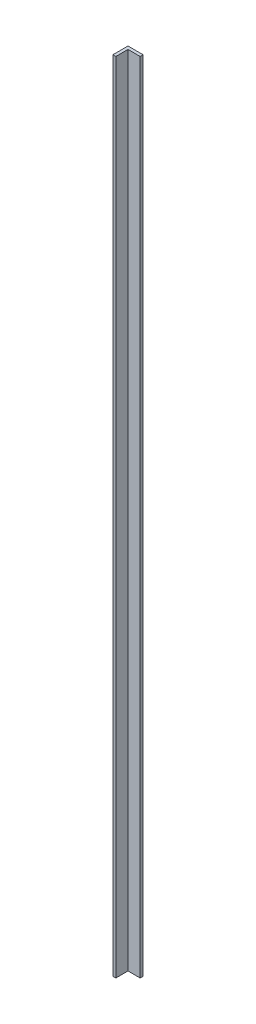
ISO-10303-21;
HEADER;
FILE_DESCRIPTION(('STEP AP214'),'2;1');
FILE_NAME('part.step','',(''),(''),'','','');
FILE_SCHEMA(('AUTOMOTIVE_DESIGN { 1 0 10303 214 1 1 1 1 }'));
ENDSEC;
DATA;
#1=APPLICATION_CONTEXT('core data for automotive mechanical design processes');
#2=APPLICATION_PROTOCOL_DEFINITION('international standard','automotive_design',2000,#1);
#3=PRODUCT_CONTEXT('',#1,'mechanical');
#4=PRODUCT('Part','Part','',(#3));
#5=PRODUCT_RELATED_PRODUCT_CATEGORY('part','',(#4));
#6=PRODUCT_DEFINITION_FORMATION('','',#4);
#7=PRODUCT_DEFINITION_CONTEXT('part definition',#1,'design');
#8=PRODUCT_DEFINITION('design','',#6,#7);
#9=PRODUCT_DEFINITION_SHAPE('','',#8);
#10=(LENGTH_UNIT() NAMED_UNIT(*) SI_UNIT(.MILLI.,.METRE.));
#11=(NAMED_UNIT(*) PLANE_ANGLE_UNIT() SI_UNIT($,.RADIAN.));
#12=(NAMED_UNIT(*) SI_UNIT($,.STERADIAN.) SOLID_ANGLE_UNIT());
#13=UNCERTAINTY_MEASURE_WITH_UNIT(LENGTH_MEASURE(1.E-05),#10,'distance_accuracy_value','');
#14=(GEOMETRIC_REPRESENTATION_CONTEXT(3) GLOBAL_UNCERTAINTY_ASSIGNED_CONTEXT((#13)) GLOBAL_UNIT_ASSIGNED_CONTEXT((#10,
#11,#12)) REPRESENTATION_CONTEXT('',''));
#15=CARTESIAN_POINT('',(0.,0.,0.));
#16=DIRECTION('',(0.,0.,1.));
#17=DIRECTION('',(1.,0.,0.));
#18=AXIS2_PLACEMENT_3D('',#15,#16,#17);
#19=CARTESIAN_POINT('',(0.,427.1518,0.));
#20=DIRECTION('',(-1.,0.,0.));
#21=DIRECTION('',(0.,0.,1.));
#22=AXIS2_PLACEMENT_3D('',#19,#20,#21);
#23=PLANE('',#22);
#24=DIRECTION('',(0.,0.,-1.));
#25=VECTOR('',#24,1.);
#26=CARTESIAN_POINT('',(0.,0.,0.));
#27=LINE('',#26,#25);
#28=CARTESIAN_POINT('',(0.,0.,6.5));
#29=VERTEX_POINT('',#28);
#30=CARTESIAN_POINT('',(0.,0.,0.));
#31=VERTEX_POINT('',#30);
#32=EDGE_CURVE('E117',#29,#31,#27,.T.);
#33=ORIENTED_EDGE('',*,*,#32,.T.);
#34=DIRECTION('',(0.,-1.,0.));
#35=VECTOR('',#34,1.);
#36=CARTESIAN_POINT('',(0.,427.1518,0.));
#37=LINE('',#36,#35);
#38=CARTESIAN_POINT('',(0.,427.1518,0.));
#39=VERTEX_POINT('',#38);
#40=EDGE_CURVE('E11',#39,#31,#37,.T.);
#41=ORIENTED_EDGE('',*,*,#40,.F.);
#42=DIRECTION('',(0.,0.,-1.));
#43=VECTOR('',#42,1.);
#44=CARTESIAN_POINT('',(0.,427.1518,0.));
#45=LINE('',#44,#43);
#46=CARTESIAN_POINT('',(0.,427.1518,6.5));
#47=VERTEX_POINT('',#46);
#48=EDGE_CURVE('E127',#47,#39,#45,.T.);
#49=ORIENTED_EDGE('',*,*,#48,.F.);
#50=DIRECTION('',(0.,-1.,0.));
#51=VECTOR('',#50,1.);
#52=CARTESIAN_POINT('',(0.,427.1518,6.5));
#53=LINE('',#52,#51);
#54=EDGE_CURVE('E113',#47,#29,#53,.T.);
#55=ORIENTED_EDGE('',*,*,#54,.T.);
#56=EDGE_LOOP('',(#33,#41,#49,#55));
#57=FACE_BOUND('',#56,.T.);
#58=ADVANCED_FACE('F33',(#57),#23,.F.);
#59=CARTESIAN_POINT('',(0.,427.1518,0.));
#60=DIRECTION('',(0.,0.,-1.));
#61=DIRECTION('',(-1.,0.,0.));
#62=AXIS2_PLACEMENT_3D('',#59,#60,#61);
#63=PLANE('',#62);
#64=DIRECTION('',(1.,0.,0.));
#65=VECTOR('',#64,1.);
#66=CARTESIAN_POINT('',(0.,0.,0.));
#67=LINE('',#66,#65);
#68=CARTESIAN_POINT('',(6.5,0.,0.));
#69=VERTEX_POINT('',#68);
#70=EDGE_CURVE('E120',#31,#69,#67,.T.);
#71=ORIENTED_EDGE('',*,*,#70,.T.);
#72=DIRECTION('',(0.,-1.,0.));
#73=VECTOR('',#72,1.);
#74=CARTESIAN_POINT('',(6.5,427.1518,0.));
#75=LINE('',#74,#73);
#76=CARTESIAN_POINT('',(6.5,427.1518,0.));
#77=VERTEX_POINT('',#76);
#78=EDGE_CURVE('E41',#77,#69,#75,.T.);
#79=ORIENTED_EDGE('',*,*,#78,.F.);
#80=DIRECTION('',(1.,0.,0.));
#81=VECTOR('',#80,1.);
#82=CARTESIAN_POINT('',(0.,427.1518,0.));
#83=LINE('',#82,#81);
#84=EDGE_CURVE('E86',#39,#77,#83,.T.);
#85=ORIENTED_EDGE('',*,*,#84,.F.);
#86=ORIENTED_EDGE('',*,*,#40,.T.);
#87=EDGE_LOOP('',(#71,#79,#85,#86));
#88=FACE_BOUND('',#87,.T.);
#89=ADVANCED_FACE('F151',(#88),#63,.F.);
#90=CARTESIAN_POINT('',(6.5,427.1518,0.));
#91=DIRECTION('',(-1.,0.,0.));
#92=DIRECTION('',(0.,0.,1.));
#93=AXIS2_PLACEMENT_3D('',#90,#91,#92);
#94=PLANE('',#93);
#95=DIRECTION('',(0.,0.,-1.));
#96=VECTOR('',#95,1.);
#97=CARTESIAN_POINT('',(6.5,0.,0.));
#98=LINE('',#97,#96);
#99=CARTESIAN_POINT('',(6.5,0.,-1.5875));
#100=VERTEX_POINT('',#99);
#101=EDGE_CURVE('E122',#69,#100,#98,.T.);
#102=ORIENTED_EDGE('',*,*,#101,.T.);
#103=DIRECTION('',(0.,-1.,0.));
#104=VECTOR('',#103,1.);
#105=CARTESIAN_POINT('',(6.5,427.1518,-1.5875));
#106=LINE('',#105,#104);
#107=CARTESIAN_POINT('',(6.5,427.1518,-1.5875));
#108=VERTEX_POINT('',#107);
#109=EDGE_CURVE('E108',#108,#100,#106,.T.);
#110=ORIENTED_EDGE('',*,*,#109,.F.);
#111=DIRECTION('',(0.,0.,-1.));
#112=VECTOR('',#111,1.);
#113=CARTESIAN_POINT('',(6.5,427.1518,0.));
#114=LINE('',#113,#112);
#115=EDGE_CURVE('E99',#77,#108,#114,.T.);
#116=ORIENTED_EDGE('',*,*,#115,.F.);
#117=ORIENTED_EDGE('',*,*,#78,.T.);
#118=EDGE_LOOP('',(#102,#110,#116,#117));
#119=FACE_BOUND('',#118,.T.);
#120=ADVANCED_FACE('F133',(#119),#94,.F.);
#121=CARTESIAN_POINT('',(-1.5875,427.1518,-1.5875));
#122=DIRECTION('',(0.,0.,1.));
#123=DIRECTION('',(1.,0.,0.));
#124=AXIS2_PLACEMENT_3D('',#121,#122,#123);
#125=PLANE('',#124);
#126=DIRECTION('',(-1.,0.,0.));
#127=VECTOR('',#126,1.);
#128=CARTESIAN_POINT('',(-1.5875,0.,-1.5875));
#129=LINE('',#128,#127);
#130=CARTESIAN_POINT('',(-1.5875,0.,-1.5875));
#131=VERTEX_POINT('',#130);
#132=EDGE_CURVE('E107',#100,#131,#129,.T.);
#133=ORIENTED_EDGE('',*,*,#132,.T.);
#134=DIRECTION('',(0.,-1.,0.));
#135=VECTOR('',#134,1.);
#136=CARTESIAN_POINT('',(-1.5875,427.1518,-1.5875));
#137=LINE('',#136,#135);
#138=CARTESIAN_POINT('',(-1.5875,427.1518,-1.5875));
#139=VERTEX_POINT('',#138);
#140=EDGE_CURVE('E104',#139,#131,#137,.T.);
#141=ORIENTED_EDGE('',*,*,#140,.F.);
#142=DIRECTION('',(-1.,0.,0.));
#143=VECTOR('',#142,1.);
#144=CARTESIAN_POINT('',(-1.5875,427.1518,-1.5875));
#145=LINE('',#144,#143);
#146=EDGE_CURVE('E93',#108,#139,#145,.T.);
#147=ORIENTED_EDGE('',*,*,#146,.F.);
#148=ORIENTED_EDGE('',*,*,#109,.T.);
#149=EDGE_LOOP('',(#133,#141,#147,#148));
#150=FACE_BOUND('',#149,.T.);
#151=ADVANCED_FACE('F105',(#150),#125,.F.);
#152=CARTESIAN_POINT('',(-1.5875,427.1518,-1.5875));
#153=DIRECTION('',(1.,0.,0.));
#154=DIRECTION('',(0.,0.,-1.));
#155=AXIS2_PLACEMENT_3D('',#152,#153,#154);
#156=PLANE('',#155);
#157=DIRECTION('',(0.,0.,1.));
#158=VECTOR('',#157,1.);
#159=CARTESIAN_POINT('',(-1.5875,0.,-1.5875));
#160=LINE('',#159,#158);
#161=CARTESIAN_POINT('',(-1.5875,0.,6.5));
#162=VERTEX_POINT('',#161);
#163=EDGE_CURVE('E72',#131,#162,#160,.T.);
#164=ORIENTED_EDGE('',*,*,#163,.T.);
#165=DIRECTION('',(0.,-1.,0.));
#166=VECTOR('',#165,1.);
#167=CARTESIAN_POINT('',(-1.5875,427.1518,6.5));
#168=LINE('',#167,#166);
#169=CARTESIAN_POINT('',(-1.5875,427.1518,6.5));
#170=VERTEX_POINT('',#169);
#171=EDGE_CURVE('E109',#170,#162,#168,.T.);
#172=ORIENTED_EDGE('',*,*,#171,.F.);
#173=DIRECTION('',(0.,0.,1.));
#174=VECTOR('',#173,1.);
#175=CARTESIAN_POINT('',(-1.5875,427.1518,-1.5875));
#176=LINE('',#175,#174);
#177=EDGE_CURVE('E97',#139,#170,#176,.T.);
#178=ORIENTED_EDGE('',*,*,#177,.F.);
#179=ORIENTED_EDGE('',*,*,#140,.T.);
#180=EDGE_LOOP('',(#164,#172,#178,#179));
#181=FACE_BOUND('',#180,.T.);
#182=ADVANCED_FACE('F111',(#181),#156,.F.);
#183=CARTESIAN_POINT('',(-1.5875,427.1518,6.5));
#184=DIRECTION('',(0.,0.,-1.));
#185=DIRECTION('',(-1.,0.,0.));
#186=AXIS2_PLACEMENT_3D('',#183,#184,#185);
#187=PLANE('',#186);
#188=DIRECTION('',(1.,0.,0.));
#189=VECTOR('',#188,1.);
#190=CARTESIAN_POINT('',(-1.5875,0.,6.5));
#191=LINE('',#190,#189);
#192=EDGE_CURVE('E78',#162,#29,#191,.T.);
#193=ORIENTED_EDGE('',*,*,#192,.T.);
#194=ORIENTED_EDGE('',*,*,#54,.F.);
#195=DIRECTION('',(1.,0.,0.));
#196=VECTOR('',#195,1.);
#197=CARTESIAN_POINT('',(-1.5875,427.1518,6.5));
#198=LINE('',#197,#196);
#199=EDGE_CURVE('E49',#170,#47,#198,.T.);
#200=ORIENTED_EDGE('',*,*,#199,.F.);
#201=ORIENTED_EDGE('',*,*,#171,.T.);
#202=EDGE_LOOP('',(#193,#194,#200,#201));
#203=FACE_BOUND('',#202,.T.);
#204=ADVANCED_FACE('F140',(#203),#187,.F.);
#205=CARTESIAN_POINT('',(0.,427.1518,0.));
#206=DIRECTION('',(0.,1.,0.));
#207=DIRECTION('',(0.,0.,1.));
#208=AXIS2_PLACEMENT_3D('',#205,#206,#207);
#209=PLANE('',#208);
#210=ORIENTED_EDGE('',*,*,#48,.T.);
#211=ORIENTED_EDGE('',*,*,#84,.T.);
#212=ORIENTED_EDGE('',*,*,#115,.T.);
#213=ORIENTED_EDGE('',*,*,#146,.T.);
#214=ORIENTED_EDGE('',*,*,#177,.T.);
#215=ORIENTED_EDGE('',*,*,#199,.T.);
#216=EDGE_LOOP('',(#210,#211,#212,#213,#214,#215));
#217=FACE_BOUND('',#216,.T.);
#218=ADVANCED_FACE('F95',(#217),#209,.T.);
#219=CARTESIAN_POINT('',(0.,0.,0.));
#220=DIRECTION('',(0.,1.,0.));
#221=DIRECTION('',(0.,0.,1.));
#222=AXIS2_PLACEMENT_3D('',#219,#220,#221);
#223=PLANE('',#222);
#224=ORIENTED_EDGE('',*,*,#32,.F.);
#225=ORIENTED_EDGE('',*,*,#192,.F.);
#226=ORIENTED_EDGE('',*,*,#163,.F.);
#227=ORIENTED_EDGE('',*,*,#132,.F.);
#228=ORIENTED_EDGE('',*,*,#101,.F.);
#229=ORIENTED_EDGE('',*,*,#70,.F.);
#230=EDGE_LOOP('',(#224,#225,#226,#227,#228,#229));
#231=FACE_BOUND('',#230,.T.);
#232=ADVANCED_FACE('F136',(#231),#223,.F.);
#233=CLOSED_SHELL('',(#58,#89,#120,#151,#182,#204,#218,#232));
#234=MANIFOLD_SOLID_BREP('B2',#233);
#235=ADVANCED_BREP_SHAPE_REPRESENTATION('',(#18,#234),#14);
#236=SHAPE_DEFINITION_REPRESENTATION(#9,#235);
ENDSEC;
END-ISO-10303-21;
